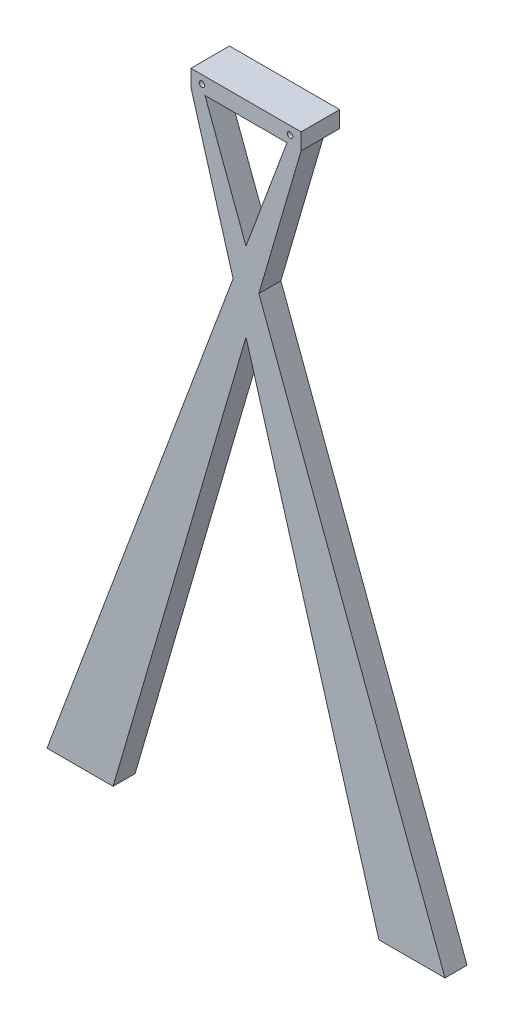
ISO-10303-21;
HEADER;
FILE_DESCRIPTION(('STEP AP214'),'2;1');
FILE_NAME('part.step','',(''),(''),'','','');
FILE_SCHEMA(('AUTOMOTIVE_DESIGN { 1 0 10303 214 1 1 1 1 }'));
ENDSEC;
DATA;
#1=APPLICATION_CONTEXT('core data for automotive mechanical design processes');
#2=APPLICATION_PROTOCOL_DEFINITION('international standard','automotive_design',2000,#1);
#3=PRODUCT_CONTEXT('',#1,'mechanical');
#4=PRODUCT('Part','Part','',(#3));
#5=PRODUCT_RELATED_PRODUCT_CATEGORY('part','',(#4));
#6=PRODUCT_DEFINITION_FORMATION('','',#4);
#7=PRODUCT_DEFINITION_CONTEXT('part definition',#1,'design');
#8=PRODUCT_DEFINITION('design','',#6,#7);
#9=PRODUCT_DEFINITION_SHAPE('','',#8);
#10=(LENGTH_UNIT() NAMED_UNIT(*) SI_UNIT(.MILLI.,.METRE.));
#11=(NAMED_UNIT(*) PLANE_ANGLE_UNIT() SI_UNIT($,.RADIAN.));
#12=(NAMED_UNIT(*) SI_UNIT($,.STERADIAN.) SOLID_ANGLE_UNIT());
#13=UNCERTAINTY_MEASURE_WITH_UNIT(LENGTH_MEASURE(1.E-05),#10,'distance_accuracy_value','');
#14=(GEOMETRIC_REPRESENTATION_CONTEXT(3) GLOBAL_UNCERTAINTY_ASSIGNED_CONTEXT((#13)) GLOBAL_UNIT_ASSIGNED_CONTEXT((#10,
#11,#12)) REPRESENTATION_CONTEXT('',''));
#15=CARTESIAN_POINT('',(0.,0.,0.));
#16=DIRECTION('',(0.,0.,1.));
#17=DIRECTION('',(1.,0.,0.));
#18=AXIS2_PLACEMENT_3D('',#15,#16,#17);
#19=CARTESIAN_POINT('',(-220.433151574425,-289.463177462395,-12.199993));
#20=DIRECTION('',(0.,0.,1.));
#21=DIRECTION('',(1.,0.,0.));
#22=AXIS2_PLACEMENT_3D('',#19,#20,#21);
#23=PLANE('',#22);
#24=DIRECTION('',(-1.,0.,0.));
#25=VECTOR('',#24,1.);
#26=CARTESIAN_POINT('',(72.534115739858,453.486413037605,-12.199993));
#27=LINE('',#26,#25);
#28=CARTESIAN_POINT('',(72.534115739858,453.486413037605,-12.199993));
#29=VERTEX_POINT('',#28);
#30=CARTESIAN_POINT('',(56.2864357232215,453.486413037605,-12.199993));
#31=VERTEX_POINT('',#30);
#32=EDGE_CURVE('E81',#29,#31,#27,.T.);
#33=ORIENTED_EDGE('',*,*,#32,.F.);
#34=DIRECTION('',(-0.280087736285585,-0.959974405899666,0.));
#35=VECTOR('',#34,1.);
#36=CARTESIAN_POINT('',(-150.211014748901,-309.951598007488,-12.199993));
#37=LINE('',#36,#35);
#38=CARTESIAN_POINT('',(23.8854740145729,286.74776336521,-12.199993));
#39=VERTEX_POINT('',#38);
#40=EDGE_CURVE('E213',#29,#39,#37,.T.);
#41=ORIENTED_EDGE('',*,*,#40,.T.);
#42=DIRECTION('',(0.349036413692419,-0.937109162220034,0.));
#43=VECTOR('',#42,1.);
#44=CARTESIAN_POINT('',(182.591094037783,-139.352450782137,-12.199993));
#45=LINE('',#44,#43);
#46=CARTESIAN_POINT('',(238.501453054141,-289.463177462395,-12.199993));
#47=VERTEX_POINT('',#46);
#48=EDGE_CURVE('E210',#39,#47,#45,.T.);
#49=ORIENTED_EDGE('',*,*,#48,.T.);
#50=DIRECTION('',(1.,0.,0.));
#51=VECTOR('',#50,1.);
#52=CARTESIAN_POINT('',(-220.433151574425,-289.463177462395,-12.199993));
#53=LINE('',#52,#51);
#54=CARTESIAN_POINT('',(162.301495054141,-289.463177462395,-12.199993));
#55=VERTEX_POINT('',#54);
#56=EDGE_CURVE('E207',#55,#47,#53,.T.);
#57=ORIENTED_EDGE('',*,*,#56,.F.);
#58=DIRECTION('',(0.280087736285586,-0.959974405899666,0.));
#59=VECTOR('',#58,1.);
#60=CARTESIAN_POINT('',(132.276291171196,-186.554611590175,-12.199993));
#61=LINE('',#60,#59);
#62=CARTESIAN_POINT('',(9.034150739858,235.846247909597,-12.199993));
#63=VERTEX_POINT('',#62);
#64=EDGE_CURVE('E204',#63,#55,#61,.T.);
#65=ORIENTED_EDGE('',*,*,#64,.F.);
#66=DIRECTION('',(-0.280087736285585,-0.959974405899666,0.));
#67=VECTOR('',#66,1.);
#68=CARTESIAN_POINT('',(-150.211014748901,-309.951598007488,-12.199993));
#69=LINE('',#68,#67);
#70=CARTESIAN_POINT('',(-144.233193574425,-289.463177462395,-12.199993));
#71=VERTEX_POINT('',#70);
#72=EDGE_CURVE('E201',#63,#71,#69,.T.);
#73=ORIENTED_EDGE('',*,*,#72,.T.);
#74=DIRECTION('',(1.,0.,0.));
#75=VECTOR('',#74,1.);
#76=CARTESIAN_POINT('',(-220.433151574425,-289.463177462395,-12.199993));
#77=LINE('',#76,#75);
#78=CARTESIAN_POINT('',(-220.433151574425,-289.463177462395,-12.199993));
#79=VERTEX_POINT('',#78);
#80=EDGE_CURVE('E220',#79,#71,#77,.T.);
#81=ORIENTED_EDGE('',*,*,#80,.F.);
#82=DIRECTION('',(-0.349036413692419,-0.937109162220035,0.));
#83=VECTOR('',#82,1.);
#84=CARTESIAN_POINT('',(-220.433151574425,-289.463177462395,-12.199993));
#85=LINE('',#84,#83);
#86=CARTESIAN_POINT('',(-5.81717253485701,286.74776336521,-12.199993));
#87=VERTEX_POINT('',#86);
#88=EDGE_CURVE('E218',#87,#79,#85,.T.);
#89=ORIENTED_EDGE('',*,*,#88,.F.);
#90=DIRECTION('',(0.280087736285586,-0.959974405899666,0.));
#91=VECTOR('',#90,1.);
#92=CARTESIAN_POINT('',(132.276291171196,-186.554611590175,-12.199993));
#93=LINE('',#92,#91);
#94=CARTESIAN_POINT('',(-54.465814260142,453.486413037605,-12.199993));
#95=VERTEX_POINT('',#94);
#96=EDGE_CURVE('E216',#95,#87,#93,.T.);
#97=ORIENTED_EDGE('',*,*,#96,.F.);
#98=CARTESIAN_POINT('',(-38.2181342435056,453.486413037605,-12.199993));
#99=VERTEX_POINT('',#98);
#100=EDGE_CURVE('E12',#99,#95,#27,.T.);
#101=ORIENTED_EDGE('',*,*,#100,.F.);
#102=DIRECTION('',(0.349036413692419,-0.937109162220034,0.));
#103=VECTOR('',#102,1.);
#104=CARTESIAN_POINT('',(182.591094037783,-139.352450782137,-12.199993));
#105=LINE('',#104,#103);
#106=CARTESIAN_POINT('',(9.034150739858,326.621285341319,-12.199993));
#107=VERTEX_POINT('',#106);
#108=EDGE_CURVE('E224',#99,#107,#105,.T.);
#109=ORIENTED_EDGE('',*,*,#108,.T.);
#110=DIRECTION('',(-0.349036413692419,-0.937109162220035,0.));
#111=VECTOR('',#110,1.);
#112=CARTESIAN_POINT('',(-220.433151574425,-289.463177462395,-12.199993));
#113=LINE('',#112,#111);
#114=EDGE_CURVE('E184',#31,#107,#113,.T.);
#115=ORIENTED_EDGE('',*,*,#114,.F.);
#116=EDGE_LOOP('',(#33,#41,#49,#57,#65,#73,#81,#89,#97,#101,#109,#115));
#117=FACE_BOUND('',#116,.T.);
#118=ADVANCED_FACE('F69',(#117),#23,.F.);
#119=CARTESIAN_POINT('',(-220.433151574425,-289.463177462395,13.199993));
#120=DIRECTION('',(0.937109162220034,-0.349036413692419,0.));
#121=DIRECTION('',(0.349036413692419,0.937109162220035,0.));
#122=AXIS2_PLACEMENT_3D('',#119,#120,#121);
#123=PLANE('',#122);
#124=ORIENTED_EDGE('',*,*,#114,.T.);
#125=DIRECTION('',(0.,0.,-1.));
#126=VECTOR('',#125,1.);
#127=CARTESIAN_POINT('',(9.034150739858,326.621285341319,13.199993));
#128=LINE('',#127,#126);
#129=CARTESIAN_POINT('',(9.034150739858,326.621285341319,13.199993));
#130=VERTEX_POINT('',#129);
#131=EDGE_CURVE('E79',#130,#107,#128,.T.);
#132=ORIENTED_EDGE('',*,*,#131,.F.);
#133=DIRECTION('',(-0.349036413692419,-0.937109162220035,0.));
#134=VECTOR('',#133,1.);
#135=CARTESIAN_POINT('',(-220.433151574425,-289.463177462395,13.199993));
#136=LINE('',#135,#134);
#137=CARTESIAN_POINT('',(56.2864357232215,453.486413037605,13.199993));
#138=VERTEX_POINT('',#137);
#139=EDGE_CURVE('E175',#138,#130,#136,.T.);
#140=ORIENTED_EDGE('',*,*,#139,.F.);
#141=DIRECTION('',(0.,0.,-1.));
#142=VECTOR('',#141,1.);
#143=CARTESIAN_POINT('',(56.2864357232215,453.486413037605,13.199993));
#144=LINE('',#143,#142);
#145=EDGE_CURVE('E134',#138,#31,#144,.T.);
#146=ORIENTED_EDGE('',*,*,#145,.T.);
#147=EDGE_LOOP('',(#124,#132,#140,#146));
#148=FACE_BOUND('',#147,.T.);
#149=ADVANCED_FACE('F183',(#148),#123,.F.);
#150=CARTESIAN_POINT('',(182.591094037783,-139.352450782137,13.199993));
#151=DIRECTION('',(0.937109162220034,0.349036413692419,0.));
#152=DIRECTION('',(-0.349036413692419,0.937109162220034,0.));
#153=AXIS2_PLACEMENT_3D('',#150,#151,#152);
#154=PLANE('',#153);
#155=ORIENTED_EDGE('',*,*,#108,.F.);
#156=DIRECTION('',(0.,0.,-1.));
#157=VECTOR('',#156,1.);
#158=CARTESIAN_POINT('',(-38.2181342435056,453.486413037605,13.199993));
#159=LINE('',#158,#157);
#160=CARTESIAN_POINT('',(-38.2181342435056,453.486413037605,13.199993));
#161=VERTEX_POINT('',#160);
#162=EDGE_CURVE('E187',#161,#99,#159,.T.);
#163=ORIENTED_EDGE('',*,*,#162,.F.);
#164=DIRECTION('',(0.349036413692419,-0.937109162220034,0.));
#165=VECTOR('',#164,1.);
#166=CARTESIAN_POINT('',(182.591094037783,-139.352450782137,13.199993));
#167=LINE('',#166,#165);
#168=EDGE_CURVE('E180',#161,#130,#167,.T.);
#169=ORIENTED_EDGE('',*,*,#168,.T.);
#170=ORIENTED_EDGE('',*,*,#131,.T.);
#171=EDGE_LOOP('',(#155,#163,#169,#170));
#172=FACE_BOUND('',#171,.T.);
#173=ADVANCED_FACE('F189',(#172),#154,.T.);
#174=CARTESIAN_POINT('',(-150.211014748901,-309.951598007488,13.199993));
#175=DIRECTION('',(0.959974405899666,-0.280087736285585,0.));
#176=DIRECTION('',(0.280087736285585,0.959974405899666,0.));
#177=AXIS2_PLACEMENT_3D('',#174,#175,#176);
#178=PLANE('',#177);
#179=ORIENTED_EDGE('',*,*,#72,.F.);
#180=DIRECTION('',(0.,0.,-1.));
#181=VECTOR('',#180,1.);
#182=CARTESIAN_POINT('',(9.034150739858,235.846247909597,13.199993));
#183=LINE('',#182,#181);
#184=CARTESIAN_POINT('',(9.034150739858,235.846247909597,13.199993));
#185=VERTEX_POINT('',#184);
#186=EDGE_CURVE('E73',#185,#63,#183,.T.);
#187=ORIENTED_EDGE('',*,*,#186,.F.);
#188=DIRECTION('',(-0.280087736285585,-0.959974405899666,0.));
#189=VECTOR('',#188,1.);
#190=CARTESIAN_POINT('',(-150.211014748901,-309.951598007488,13.199993));
#191=LINE('',#190,#189);
#192=CARTESIAN_POINT('',(-144.233193574425,-289.463177462395,13.199993));
#193=VERTEX_POINT('',#192);
#194=EDGE_CURVE('E226',#185,#193,#191,.T.);
#195=ORIENTED_EDGE('',*,*,#194,.T.);
#196=DIRECTION('',(0.,0.,-1.));
#197=VECTOR('',#196,1.);
#198=CARTESIAN_POINT('',(-144.233193574425,-289.463177462395,13.199993));
#199=LINE('',#198,#197);
#200=EDGE_CURVE('E200',#193,#71,#199,.T.);
#201=ORIENTED_EDGE('',*,*,#200,.T.);
#202=EDGE_LOOP('',(#179,#187,#195,#201));
#203=FACE_BOUND('',#202,.T.);
#204=ADVANCED_FACE('F71',(#203),#178,.T.);
#205=CARTESIAN_POINT('',(132.276291171196,-186.554611590175,13.199993));
#206=DIRECTION('',(0.959974405899666,0.280087736285586,0.));
#207=DIRECTION('',(-0.280087736285586,0.959974405899666,0.));
#208=AXIS2_PLACEMENT_3D('',#205,#206,#207);
#209=PLANE('',#208);
#210=ORIENTED_EDGE('',*,*,#64,.T.);
#211=DIRECTION('',(0.,0.,-1.));
#212=VECTOR('',#211,1.);
#213=CARTESIAN_POINT('',(162.301495054141,-289.463177462395,13.199993));
#214=LINE('',#213,#212);
#215=CARTESIAN_POINT('',(162.301495054141,-289.463177462395,13.199993));
#216=VERTEX_POINT('',#215);
#217=EDGE_CURVE('E251',#216,#55,#214,.T.);
#218=ORIENTED_EDGE('',*,*,#217,.F.);
#219=DIRECTION('',(0.280087736285586,-0.959974405899666,0.));
#220=VECTOR('',#219,1.);
#221=CARTESIAN_POINT('',(132.276291171196,-186.554611590175,13.199993));
#222=LINE('',#221,#220);
#223=EDGE_CURVE('E260',#185,#216,#222,.T.);
#224=ORIENTED_EDGE('',*,*,#223,.F.);
#225=ORIENTED_EDGE('',*,*,#186,.T.);
#226=EDGE_LOOP('',(#210,#218,#224,#225));
#227=FACE_BOUND('',#226,.T.);
#228=ADVANCED_FACE('F259',(#227),#209,.F.);
#229=CARTESIAN_POINT('',(-220.433151574425,-289.463177462395,13.199993));
#230=DIRECTION('',(0.,1.,0.));
#231=DIRECTION('',(-1.,0.,0.));
#232=AXIS2_PLACEMENT_3D('',#229,#230,#231);
#233=PLANE('',#232);
#234=ORIENTED_EDGE('',*,*,#56,.T.);
#235=DIRECTION('',(0.,0.,-1.));
#236=VECTOR('',#235,1.);
#237=CARTESIAN_POINT('',(238.501453054141,-289.463177462395,13.199993));
#238=LINE('',#237,#236);
#239=CARTESIAN_POINT('',(238.501453054141,-289.463177462395,13.199993));
#240=VERTEX_POINT('',#239);
#241=EDGE_CURVE('E250',#240,#47,#238,.T.);
#242=ORIENTED_EDGE('',*,*,#241,.F.);
#243=DIRECTION('',(1.,0.,0.));
#244=VECTOR('',#243,1.);
#245=CARTESIAN_POINT('',(-220.433151574425,-289.463177462395,13.199993));
#246=LINE('',#245,#244);
#247=EDGE_CURVE('E299',#216,#240,#246,.T.);
#248=ORIENTED_EDGE('',*,*,#247,.F.);
#249=ORIENTED_EDGE('',*,*,#217,.T.);
#250=EDGE_LOOP('',(#234,#242,#248,#249));
#251=FACE_BOUND('',#250,.T.);
#252=ADVANCED_FACE('F397',(#251),#233,.F.);
#253=CARTESIAN_POINT('',(182.591094037783,-139.352450782137,13.199993));
#254=DIRECTION('',(0.937109162220034,0.349036413692419,0.));
#255=DIRECTION('',(-0.349036413692419,0.937109162220034,0.));
#256=AXIS2_PLACEMENT_3D('',#253,#254,#255);
#257=PLANE('',#256);
#258=ORIENTED_EDGE('',*,*,#48,.F.);
#259=DIRECTION('',(0.,0.,-1.));
#260=VECTOR('',#259,1.);
#261=CARTESIAN_POINT('',(23.8854740145729,286.74776336521,13.199993));
#262=LINE('',#261,#260);
#263=CARTESIAN_POINT('',(23.8854740145729,286.74776336521,13.199993));
#264=VERTEX_POINT('',#263);
#265=EDGE_CURVE('E248',#264,#39,#262,.T.);
#266=ORIENTED_EDGE('',*,*,#265,.F.);
#267=DIRECTION('',(0.349036413692419,-0.937109162220034,0.));
#268=VECTOR('',#267,1.);
#269=CARTESIAN_POINT('',(182.591094037783,-139.352450782137,13.199993));
#270=LINE('',#269,#268);
#271=EDGE_CURVE('E301',#264,#240,#270,.T.);
#272=ORIENTED_EDGE('',*,*,#271,.T.);
#273=ORIENTED_EDGE('',*,*,#241,.T.);
#274=EDGE_LOOP('',(#258,#266,#272,#273));
#275=FACE_BOUND('',#274,.T.);
#276=ADVANCED_FACE('F393',(#275),#257,.T.);
#277=CARTESIAN_POINT('',(-150.211014748901,-309.951598007488,13.199993));
#278=DIRECTION('',(0.959974405899666,-0.280087736285585,0.));
#279=DIRECTION('',(0.280087736285585,0.959974405899666,0.));
#280=AXIS2_PLACEMENT_3D('',#277,#278,#279);
#281=PLANE('',#280);
#282=ORIENTED_EDGE('',*,*,#40,.F.);
#283=DIRECTION('',(0.,0.,-1.));
#284=VECTOR('',#283,1.);
#285=CARTESIAN_POINT('',(72.534115739858,453.486413037605,13.199993));
#286=LINE('',#285,#284);
#287=CARTESIAN_POINT('',(72.534115739858,453.486413037605,13.199993));
#288=VERTEX_POINT('',#287);
#289=EDGE_CURVE('E245',#288,#29,#286,.T.);
#290=ORIENTED_EDGE('',*,*,#289,.F.);
#291=DIRECTION('',(-0.280087736285585,-0.959974405899666,0.));
#292=VECTOR('',#291,1.);
#293=CARTESIAN_POINT('',(-150.211014748901,-309.951598007488,13.199993));
#294=LINE('',#293,#292);
#295=EDGE_CURVE('E304',#288,#264,#294,.T.);
#296=ORIENTED_EDGE('',*,*,#295,.T.);
#297=ORIENTED_EDGE('',*,*,#265,.T.);
#298=EDGE_LOOP('',(#282,#290,#296,#297));
#299=FACE_BOUND('',#298,.T.);
#300=ADVANCED_FACE('F389',(#299),#281,.T.);
#301=CARTESIAN_POINT('',(72.534115739858,-289.463177462395,13.199993));
#302=DIRECTION('',(1.,0.,0.));
#303=DIRECTION('',(0.,0.,-1.));
#304=AXIS2_PLACEMENT_3D('',#301,#302,#303);
#305=PLANE('',#304);
#306=ORIENTED_EDGE('',*,*,#289,.T.);
#307=DIRECTION('',(0.,0.,1.));
#308=VECTOR('',#307,1.);
#309=CARTESIAN_POINT('',(72.534115739858,453.486413037605,-31.249993));
#310=LINE('',#309,#308);
#311=CARTESIAN_POINT('',(72.534115739858,453.486413037605,-31.249993));
#312=VERTEX_POINT('',#311);
#313=EDGE_CURVE('E291',#312,#29,#310,.T.);
#314=ORIENTED_EDGE('',*,*,#313,.F.);
#315=DIRECTION('',(0.,-1.,0.));
#316=VECTOR('',#315,1.);
#317=CARTESIAN_POINT('',(72.534115739858,472.536402537605,-31.249993));
#318=LINE('',#317,#316);
#319=CARTESIAN_POINT('',(72.534115739858,472.536402537605,-31.249993));
#320=VERTEX_POINT('',#319);
#321=EDGE_CURVE('E294',#320,#312,#318,.T.);
#322=ORIENTED_EDGE('',*,*,#321,.F.);
#323=DIRECTION('',(0.,0.,-1.));
#324=VECTOR('',#323,1.);
#325=CARTESIAN_POINT('',(72.534115739858,472.536402537605,13.199993));
#326=LINE('',#325,#324);
#327=CARTESIAN_POINT('',(72.534115739858,472.536402537605,13.199993));
#328=VERTEX_POINT('',#327);
#329=EDGE_CURVE('E242',#328,#320,#326,.T.);
#330=ORIENTED_EDGE('',*,*,#329,.F.);
#331=DIRECTION('',(0.,-1.,0.));
#332=VECTOR('',#331,1.);
#333=CARTESIAN_POINT('',(72.534115739858,-289.463177462395,13.199993));
#334=LINE('',#333,#332);
#335=EDGE_CURVE('E307',#328,#288,#334,.T.);
#336=ORIENTED_EDGE('',*,*,#335,.T.);
#337=EDGE_LOOP('',(#306,#314,#322,#330,#336));
#338=FACE_BOUND('',#337,.T.);
#339=ADVANCED_FACE('F386',(#338),#305,.T.);
#340=CARTESIAN_POINT('',(-220.433151574425,472.536402537605,13.199993));
#341=DIRECTION('',(0.,1.,0.));
#342=DIRECTION('',(-1.,0.,0.));
#343=AXIS2_PLACEMENT_3D('',#340,#341,#342);
#344=PLANE('',#343);
#345=ORIENTED_EDGE('',*,*,#329,.T.);
#346=DIRECTION('',(-1.,0.,0.));
#347=VECTOR('',#346,1.);
#348=CARTESIAN_POINT('',(72.534115739858,472.536402537605,-31.249993));
#349=LINE('',#348,#347);
#350=CARTESIAN_POINT('',(-54.465814260142,472.536402537605,-31.249993));
#351=VERTEX_POINT('',#350);
#352=EDGE_CURVE('E330',#320,#351,#349,.T.);
#353=ORIENTED_EDGE('',*,*,#352,.T.);
#354=DIRECTION('',(0.,0.,-1.));
#355=VECTOR('',#354,1.);
#356=CARTESIAN_POINT('',(-54.4658142601421,472.536402537605,13.199993));
#357=LINE('',#356,#355);
#358=CARTESIAN_POINT('',(-54.4658142601421,472.536402537605,13.199993));
#359=VERTEX_POINT('',#358);
#360=EDGE_CURVE('E239',#359,#351,#357,.T.);
#361=ORIENTED_EDGE('',*,*,#360,.F.);
#362=DIRECTION('',(1.,0.,0.));
#363=VECTOR('',#362,1.);
#364=CARTESIAN_POINT('',(-220.433151574425,472.536402537605,13.199993));
#365=LINE('',#364,#363);
#366=EDGE_CURVE('E310',#359,#328,#365,.T.);
#367=ORIENTED_EDGE('',*,*,#366,.T.);
#368=EDGE_LOOP('',(#345,#353,#361,#367));
#369=FACE_BOUND('',#368,.T.);
#370=ADVANCED_FACE('F333',(#369),#344,.T.);
#371=CARTESIAN_POINT('',(-54.4658142601403,-289.463177462395,13.199993));
#372=DIRECTION('',(1.,0.,0.));
#373=DIRECTION('',(0.,1.,0.));
#374=AXIS2_PLACEMENT_3D('',#371,#372,#373);
#375=PLANE('',#374);
#376=ORIENTED_EDGE('',*,*,#360,.T.);
#377=DIRECTION('',(0.,-1.,0.));
#378=VECTOR('',#377,1.);
#379=CARTESIAN_POINT('',(-54.465814260142,472.536402537605,-31.249993));
#380=LINE('',#379,#378);
#381=CARTESIAN_POINT('',(-54.465814260142,453.486413037605,-31.249993));
#382=VERTEX_POINT('',#381);
#383=EDGE_CURVE('E290',#351,#382,#380,.T.);
#384=ORIENTED_EDGE('',*,*,#383,.T.);
#385=DIRECTION('',(0.,0.,1.));
#386=VECTOR('',#385,1.);
#387=CARTESIAN_POINT('',(-54.465814260142,453.486413037605,-31.249993));
#388=LINE('',#387,#386);
#389=EDGE_CURVE('E205',#382,#95,#388,.T.);
#390=ORIENTED_EDGE('',*,*,#389,.T.);
#391=DIRECTION('',(0.,0.,-1.));
#392=VECTOR('',#391,1.);
#393=CARTESIAN_POINT('',(-54.465814260142,453.486413037605,13.199993));
#394=LINE('',#393,#392);
#395=CARTESIAN_POINT('',(-54.465814260142,453.486413037605,13.199993));
#396=VERTEX_POINT('',#395);
#397=EDGE_CURVE('E236',#396,#95,#394,.T.);
#398=ORIENTED_EDGE('',*,*,#397,.F.);
#399=DIRECTION('',(0.,-1.,0.));
#400=VECTOR('',#399,1.);
#401=CARTESIAN_POINT('',(-54.4658142601403,-289.463177462395,13.199993));
#402=LINE('',#401,#400);
#403=EDGE_CURVE('E313',#359,#396,#402,.T.);
#404=ORIENTED_EDGE('',*,*,#403,.F.);
#405=EDGE_LOOP('',(#376,#384,#390,#398,#404));
#406=FACE_BOUND('',#405,.T.);
#407=ADVANCED_FACE('F288',(#406),#375,.F.);
#408=CARTESIAN_POINT('',(132.276291171196,-186.554611590175,13.199993));
#409=DIRECTION('',(0.959974405899666,0.280087736285586,0.));
#410=DIRECTION('',(-0.280087736285586,0.959974405899666,0.));
#411=AXIS2_PLACEMENT_3D('',#408,#409,#410);
#412=PLANE('',#411);
#413=ORIENTED_EDGE('',*,*,#96,.T.);
#414=DIRECTION('',(0.,0.,-1.));
#415=VECTOR('',#414,1.);
#416=CARTESIAN_POINT('',(-5.81717253485701,286.74776336521,13.199993));
#417=LINE('',#416,#415);
#418=CARTESIAN_POINT('',(-5.81717253485701,286.74776336521,13.199993));
#419=VERTEX_POINT('',#418);
#420=EDGE_CURVE('E233',#419,#87,#417,.T.);
#421=ORIENTED_EDGE('',*,*,#420,.F.);
#422=DIRECTION('',(0.280087736285586,-0.959974405899666,0.));
#423=VECTOR('',#422,1.);
#424=CARTESIAN_POINT('',(132.276291171196,-186.554611590175,13.199993));
#425=LINE('',#424,#423);
#426=EDGE_CURVE('E277',#396,#419,#425,.T.);
#427=ORIENTED_EDGE('',*,*,#426,.F.);
#428=ORIENTED_EDGE('',*,*,#397,.T.);
#429=EDGE_LOOP('',(#413,#421,#427,#428));
#430=FACE_BOUND('',#429,.T.);
#431=ADVANCED_FACE('F276',(#430),#412,.F.);
#432=CARTESIAN_POINT('',(-220.433151574425,-289.463177462395,13.199993));
#433=DIRECTION('',(0.937109162220034,-0.349036413692419,0.));
#434=DIRECTION('',(0.349036413692419,0.937109162220035,0.));
#435=AXIS2_PLACEMENT_3D('',#432,#433,#434);
#436=PLANE('',#435);
#437=ORIENTED_EDGE('',*,*,#88,.T.);
#438=DIRECTION('',(0.,0.,-1.));
#439=VECTOR('',#438,1.);
#440=CARTESIAN_POINT('',(-220.433151574425,-289.463177462395,13.199993));
#441=LINE('',#440,#439);
#442=CARTESIAN_POINT('',(-220.433151574425,-289.463177462395,13.199993));
#443=VERTEX_POINT('',#442);
#444=EDGE_CURVE('E230',#443,#79,#441,.T.);
#445=ORIENTED_EDGE('',*,*,#444,.F.);
#446=DIRECTION('',(-0.349036413692419,-0.937109162220035,0.));
#447=VECTOR('',#446,1.);
#448=CARTESIAN_POINT('',(-220.433151574425,-289.463177462395,13.199993));
#449=LINE('',#448,#447);
#450=EDGE_CURVE('E273',#419,#443,#449,.T.);
#451=ORIENTED_EDGE('',*,*,#450,.F.);
#452=ORIENTED_EDGE('',*,*,#420,.T.);
#453=EDGE_LOOP('',(#437,#445,#451,#452));
#454=FACE_BOUND('',#453,.T.);
#455=ADVANCED_FACE('F270',(#454),#436,.F.);
#456=CARTESIAN_POINT('',(59.834122739858,463.011407787605,13.199993));
#457=DIRECTION('',(0.,0.,-1.));
#458=DIRECTION('',(-1.,0.,0.));
#459=AXIS2_PLACEMENT_3D('',#456,#457,#458);
#460=CYLINDRICAL_SURFACE('',#459,3.17499824999999);
#461=CARTESIAN_POINT('',(59.834122739858,463.011407787605,13.199993));
#462=DIRECTION('',(0.,0.,1.));
#463=DIRECTION('',(1.,0.,0.));
#464=AXIS2_PLACEMENT_3D('',#461,#462,#463);
#465=CIRCLE('',#464,3.17499824999999);
#466=CARTESIAN_POINT('',(63.0091209898579,463.011407787605,13.199993));
#467=VERTEX_POINT('',#466);
#468=EDGE_CURVE('E191',#467,#467,#465,.T.);
#469=ORIENTED_EDGE('',*,*,#468,.T.);
#470=EDGE_LOOP('',(#469));
#471=FACE_BOUND('',#470,.T.);
#472=CARTESIAN_POINT('',(59.834122739858,463.011407787605,-31.249993));
#473=DIRECTION('',(0.,0.,-1.));
#474=DIRECTION('',(-1.,0.,0.));
#475=AXIS2_PLACEMENT_3D('',#472,#473,#474);
#476=CIRCLE('',#475,3.17499824999998);
#477=CARTESIAN_POINT('',(56.659124489858,463.011407787605,-31.249993));
#478=VERTEX_POINT('',#477);
#479=EDGE_CURVE('E341',#478,#478,#476,.T.);
#480=ORIENTED_EDGE('',*,*,#479,.T.);
#481=EDGE_LOOP('',(#480));
#482=FACE_BOUND('',#481,.T.);
#483=ADVANCED_FACE('F349',(#471,#482),#460,.F.);
#484=CARTESIAN_POINT('',(-220.433151574425,453.486413037605,13.199993));
#485=DIRECTION('',(0.,1.,0.));
#486=DIRECTION('',(0.,0.,1.));
#487=AXIS2_PLACEMENT_3D('',#484,#485,#486);
#488=PLANE('',#487);
#489=ORIENTED_EDGE('',*,*,#162,.T.);
#490=ORIENTED_EDGE('',*,*,#100,.T.);
#491=ORIENTED_EDGE('',*,*,#389,.F.);
#492=DIRECTION('',(-1.,0.,0.));
#493=VECTOR('',#492,1.);
#494=CARTESIAN_POINT('',(72.534115739858,453.486413037605,-31.249993));
#495=LINE('',#494,#493);
#496=EDGE_CURVE('E331',#312,#382,#495,.T.);
#497=ORIENTED_EDGE('',*,*,#496,.F.);
#498=ORIENTED_EDGE('',*,*,#313,.T.);
#499=ORIENTED_EDGE('',*,*,#32,.T.);
#500=ORIENTED_EDGE('',*,*,#145,.F.);
#501=DIRECTION('',(1.,0.,0.));
#502=VECTOR('',#501,1.);
#503=CARTESIAN_POINT('',(-220.433151574425,453.486413037605,13.199993));
#504=LINE('',#503,#502);
#505=EDGE_CURVE('E89',#161,#138,#504,.T.);
#506=ORIENTED_EDGE('',*,*,#505,.F.);
#507=EDGE_LOOP('',(#489,#490,#491,#497,#498,#499,#500,#506));
#508=FACE_BOUND('',#507,.T.);
#509=ADVANCED_FACE('F285',(#508),#488,.F.);
#510=CARTESIAN_POINT('',(-220.433151574425,-289.463177462395,13.199993));
#511=DIRECTION('',(0.,1.,0.));
#512=DIRECTION('',(-1.,0.,0.));
#513=AXIS2_PLACEMENT_3D('',#510,#511,#512);
#514=PLANE('',#513);
#515=ORIENTED_EDGE('',*,*,#80,.T.);
#516=ORIENTED_EDGE('',*,*,#200,.F.);
#517=DIRECTION('',(1.,0.,0.));
#518=VECTOR('',#517,1.);
#519=CARTESIAN_POINT('',(-220.433151574425,-289.463177462395,13.199993));
#520=LINE('',#519,#518);
#521=EDGE_CURVE('E181',#443,#193,#520,.T.);
#522=ORIENTED_EDGE('',*,*,#521,.F.);
#523=ORIENTED_EDGE('',*,*,#444,.T.);
#524=EDGE_LOOP('',(#515,#516,#522,#523));
#525=FACE_BOUND('',#524,.T.);
#526=ADVANCED_FACE('F266',(#525),#514,.F.);
#527=CARTESIAN_POINT('',(-41.7658212601421,463.011407787605,13.199993));
#528=DIRECTION('',(0.,0.,-1.));
#529=DIRECTION('',(-1.,0.,0.));
#530=AXIS2_PLACEMENT_3D('',#527,#528,#529);
#531=CYLINDRICAL_SURFACE('',#530,3.17499824999999);
#532=CARTESIAN_POINT('',(-41.7658212601421,463.011407787605,13.199993));
#533=DIRECTION('',(0.,0.,1.));
#534=DIRECTION('',(1.,0.,0.));
#535=AXIS2_PLACEMENT_3D('',#532,#533,#534);
#536=CIRCLE('',#535,3.17499824999999);
#537=CARTESIAN_POINT('',(-38.5908230101421,463.011407787605,13.199993));
#538=VERTEX_POINT('',#537);
#539=EDGE_CURVE('E197',#538,#538,#536,.T.);
#540=ORIENTED_EDGE('',*,*,#539,.T.);
#541=EDGE_LOOP('',(#540));
#542=FACE_BOUND('',#541,.T.);
#543=CARTESIAN_POINT('',(-41.7658212601421,463.011407787605,-31.249993));
#544=DIRECTION('',(0.,0.,-1.));
#545=DIRECTION('',(-1.,0.,0.));
#546=AXIS2_PLACEMENT_3D('',#543,#544,#545);
#547=CIRCLE('',#546,3.17499824999999);
#548=CARTESIAN_POINT('',(-44.9408195101421,463.011407787605,-31.249993));
#549=VERTEX_POINT('',#548);
#550=EDGE_CURVE('E339',#549,#549,#547,.T.);
#551=ORIENTED_EDGE('',*,*,#550,.T.);
#552=EDGE_LOOP('',(#551));
#553=FACE_BOUND('',#552,.T.);
#554=ADVANCED_FACE('F357',(#542,#553),#531,.F.);
#555=CARTESIAN_POINT('',(-220.433151574425,-289.463177462395,13.199993));
#556=DIRECTION('',(0.,0.,1.));
#557=DIRECTION('',(1.,0.,0.));
#558=AXIS2_PLACEMENT_3D('',#555,#556,#557);
#559=PLANE('',#558);
#560=ORIENTED_EDGE('',*,*,#194,.F.);
#561=ORIENTED_EDGE('',*,*,#223,.T.);
#562=ORIENTED_EDGE('',*,*,#247,.T.);
#563=ORIENTED_EDGE('',*,*,#271,.F.);
#564=ORIENTED_EDGE('',*,*,#295,.F.);
#565=ORIENTED_EDGE('',*,*,#335,.F.);
#566=ORIENTED_EDGE('',*,*,#366,.F.);
#567=ORIENTED_EDGE('',*,*,#403,.T.);
#568=ORIENTED_EDGE('',*,*,#426,.T.);
#569=ORIENTED_EDGE('',*,*,#450,.T.);
#570=ORIENTED_EDGE('',*,*,#521,.T.);
#571=EDGE_LOOP('',(#560,#561,#562,#563,#564,#565,#566,#567,#568,#569,#570));
#572=FACE_BOUND('',#571,.T.);
#573=ORIENTED_EDGE('',*,*,#139,.T.);
#574=ORIENTED_EDGE('',*,*,#168,.F.);
#575=ORIENTED_EDGE('',*,*,#505,.T.);
#576=EDGE_LOOP('',(#573,#574,#575));
#577=FACE_BOUND('',#576,.T.);
#578=ORIENTED_EDGE('',*,*,#468,.F.);
#579=EDGE_LOOP('',(#578));
#580=FACE_BOUND('',#579,.T.);
#581=ORIENTED_EDGE('',*,*,#539,.F.);
#582=EDGE_LOOP('',(#581));
#583=FACE_BOUND('',#582,.T.);
#584=ADVANCED_FACE('F177',(#572,#577,#580,#583),#559,.T.);
#585=CARTESIAN_POINT('',(0.,0.,-31.249993));
#586=DIRECTION('',(0.,0.,1.));
#587=DIRECTION('',(1.,0.,0.));
#588=AXIS2_PLACEMENT_3D('',#585,#586,#587);
#589=PLANE('',#588);
#590=ORIENTED_EDGE('',*,*,#496,.T.);
#591=ORIENTED_EDGE('',*,*,#383,.F.);
#592=ORIENTED_EDGE('',*,*,#352,.F.);
#593=ORIENTED_EDGE('',*,*,#321,.T.);
#594=EDGE_LOOP('',(#590,#591,#592,#593));
#595=FACE_BOUND('',#594,.T.);
#596=ORIENTED_EDGE('',*,*,#550,.F.);
#597=EDGE_LOOP('',(#596));
#598=FACE_BOUND('',#597,.T.);
#599=ORIENTED_EDGE('',*,*,#479,.F.);
#600=EDGE_LOOP('',(#599));
#601=FACE_BOUND('',#600,.T.);
#602=ADVANCED_FACE('F327',(#595,#598,#601),#589,.F.);
#603=CLOSED_SHELL('',(#118,#149,#173,#204,#228,#252,#276,#300,#339,#370,#407,#431,#455,#483,
#509,#526,#554,#584,#602));
#604=MANIFOLD_SOLID_BREP('B2',#603);
#605=ADVANCED_BREP_SHAPE_REPRESENTATION('',(#18,#604),#14);
#606=SHAPE_DEFINITION_REPRESENTATION(#9,#605);
ENDSEC;
END-ISO-10303-21;
